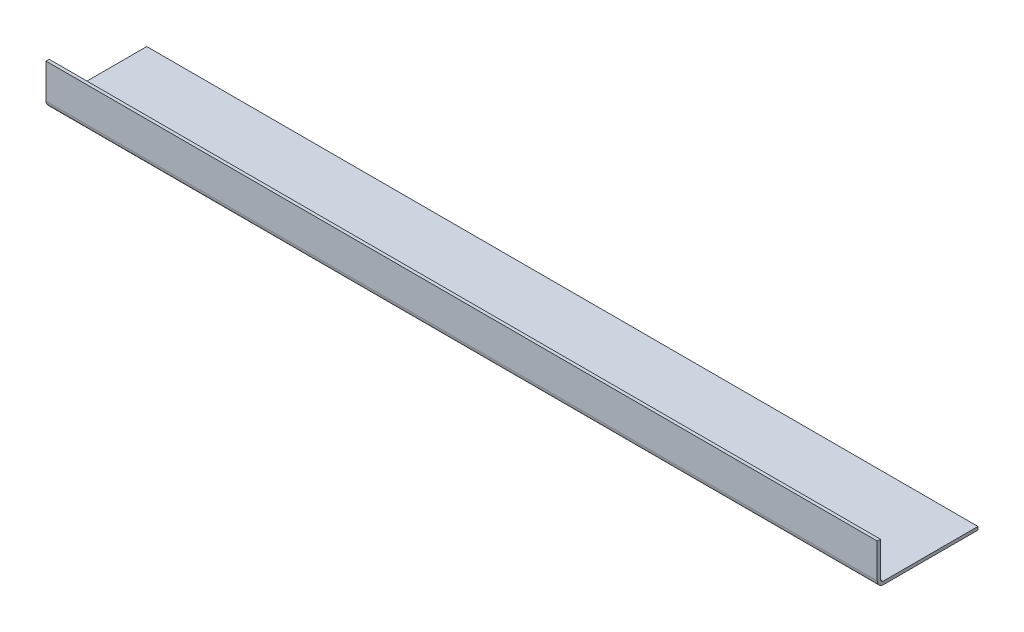
ISO-10303-21;
HEADER;
FILE_DESCRIPTION(('STEP AP214'),'2;1');
FILE_NAME('part.step','',(''),(''),'','','');
FILE_SCHEMA(('AUTOMOTIVE_DESIGN { 1 0 10303 214 1 1 1 1 }'));
ENDSEC;
DATA;
#1=APPLICATION_CONTEXT('core data for automotive mechanical design processes');
#2=APPLICATION_PROTOCOL_DEFINITION('international standard','automotive_design',2000,#1);
#3=PRODUCT_CONTEXT('',#1,'mechanical');
#4=PRODUCT('Part','Part','',(#3));
#5=PRODUCT_RELATED_PRODUCT_CATEGORY('part','',(#4));
#6=PRODUCT_DEFINITION_FORMATION('','',#4);
#7=PRODUCT_DEFINITION_CONTEXT('part definition',#1,'design');
#8=PRODUCT_DEFINITION('design','',#6,#7);
#9=PRODUCT_DEFINITION_SHAPE('','',#8);
#10=(LENGTH_UNIT() NAMED_UNIT(*) SI_UNIT(.MILLI.,.METRE.));
#11=(NAMED_UNIT(*) PLANE_ANGLE_UNIT() SI_UNIT($,.RADIAN.));
#12=(NAMED_UNIT(*) SI_UNIT($,.STERADIAN.) SOLID_ANGLE_UNIT());
#13=UNCERTAINTY_MEASURE_WITH_UNIT(LENGTH_MEASURE(1.E-05),#10,'distance_accuracy_value','');
#14=(GEOMETRIC_REPRESENTATION_CONTEXT(3) GLOBAL_UNCERTAINTY_ASSIGNED_CONTEXT((#13)) GLOBAL_UNIT_ASSIGNED_CONTEXT((#10,
#11,#12)) REPRESENTATION_CONTEXT('',''));
#15=CARTESIAN_POINT('',(0.,0.,0.));
#16=DIRECTION('',(0.,0.,1.));
#17=DIRECTION('',(1.,0.,0.));
#18=AXIS2_PLACEMENT_3D('',#15,#16,#17);
#19=CARTESIAN_POINT('',(0.,0.,-3.17499999999997));
#20=DIRECTION('',(0.,0.,-1.));
#21=DIRECTION('',(0.,1.,0.));
#22=AXIS2_PLACEMENT_3D('',#19,#20,#21);
#23=PLANE('',#22);
#24=DIRECTION('',(0.,1.,0.));
#25=VECTOR('',#24,1.);
#26=CARTESIAN_POINT('',(0.,0.,-3.17499999999997));
#27=LINE('',#26,#25);
#28=CARTESIAN_POINT('',(0.,3.17499999999997,-3.175));
#29=VERTEX_POINT('',#28);
#30=CARTESIAN_POINT('',(0.,38.1,-3.17499999999997));
#31=VERTEX_POINT('',#30);
#32=EDGE_CURVE('E89',#29,#31,#27,.T.);
#33=ORIENTED_EDGE('',*,*,#32,.T.);
#34=DIRECTION('',(1.,0.,0.));
#35=VECTOR('',#34,1.);
#36=CARTESIAN_POINT('',(0.,38.1,-3.17499999999997));
#37=LINE('',#36,#35);
#38=CARTESIAN_POINT('',(838.2,38.1,-3.17499999999997));
#39=VERTEX_POINT('',#38);
#40=EDGE_CURVE('E84',#31,#39,#37,.T.);
#41=ORIENTED_EDGE('',*,*,#40,.T.);
#42=DIRECTION('',(0.,-1.,0.));
#43=VECTOR('',#42,1.);
#44=CARTESIAN_POINT('',(838.2,38.1,-3.17499999999997));
#45=LINE('',#44,#43);
#46=CARTESIAN_POINT('',(838.2,3.17499999999997,-3.175));
#47=VERTEX_POINT('',#46);
#48=EDGE_CURVE('E79',#39,#47,#45,.T.);
#49=ORIENTED_EDGE('',*,*,#48,.T.);
#50=DIRECTION('',(1.,0.,0.));
#51=VECTOR('',#50,1.);
#52=CARTESIAN_POINT('',(838.2,3.17499999999997,-3.17500000000003));
#53=LINE('',#52,#51);
#54=EDGE_CURVE('E81',#47,#29,#53,.F.);
#55=ORIENTED_EDGE('',*,*,#54,.T.);
#56=EDGE_LOOP('',(#33,#41,#49,#55));
#57=FACE_BOUND('',#56,.T.);
#58=ADVANCED_FACE('F17',(#57),#23,.T.);
#59=CARTESIAN_POINT('',(0.,38.1,0.));
#60=DIRECTION('',(0.,-1.,0.));
#61=DIRECTION('',(0.,0.,-1.));
#62=AXIS2_PLACEMENT_3D('',#59,#60,#61);
#63=PLANE('',#62);
#64=DIRECTION('',(0.,0.,1.));
#65=VECTOR('',#64,1.);
#66=CARTESIAN_POINT('',(0.,38.1,0.));
#67=LINE('',#66,#65);
#68=CARTESIAN_POINT('',(0.,38.1,0.));
#69=VERTEX_POINT('',#68);
#70=EDGE_CURVE('E99',#31,#69,#67,.T.);
#71=ORIENTED_EDGE('',*,*,#70,.T.);
#72=DIRECTION('',(1.,0.,0.));
#73=VECTOR('',#72,1.);
#74=CARTESIAN_POINT('',(0.,38.1,0.));
#75=LINE('',#74,#73);
#76=CARTESIAN_POINT('',(838.2,38.1,0.));
#77=VERTEX_POINT('',#76);
#78=EDGE_CURVE('E107',#69,#77,#75,.T.);
#79=ORIENTED_EDGE('',*,*,#78,.T.);
#80=DIRECTION('',(0.,0.,1.));
#81=VECTOR('',#80,1.);
#82=CARTESIAN_POINT('',(838.2,38.1,0.));
#83=LINE('',#82,#81);
#84=EDGE_CURVE('E90',#77,#39,#83,.F.);
#85=ORIENTED_EDGE('',*,*,#84,.T.);
#86=ORIENTED_EDGE('',*,*,#40,.F.);
#87=EDGE_LOOP('',(#71,#79,#85,#86));
#88=FACE_BOUND('',#87,.T.);
#89=ADVANCED_FACE('F183',(#88),#63,.F.);
#90=CARTESIAN_POINT('',(838.2,3.17499999999997,-6.35000000000002));
#91=DIRECTION('',(1.,0.,0.));
#92=DIRECTION('',(0.,1.,0.));
#93=AXIS2_PLACEMENT_3D('',#90,#91,#92);
#94=CYLINDRICAL_SURFACE('',#93,3.175);
#95=CARTESIAN_POINT('',(0.,3.17499999999997,-6.35000000000002));
#96=DIRECTION('',(1.,0.,0.));
#97=DIRECTION('',(0.,1.,0.));
#98=AXIS2_PLACEMENT_3D('',#95,#96,#97);
#99=CIRCLE('',#98,3.175);
#100=CARTESIAN_POINT('',(0.,0.,-6.35000000000002));
#101=VERTEX_POINT('',#100);
#102=EDGE_CURVE('E98',#29,#101,#99,.T.);
#103=ORIENTED_EDGE('',*,*,#102,.F.);
#104=ORIENTED_EDGE('',*,*,#54,.F.);
#105=CARTESIAN_POINT('',(838.2,3.17499999999997,-6.35000000000002));
#106=DIRECTION('',(1.,0.,0.));
#107=DIRECTION('',(0.,1.,0.));
#108=AXIS2_PLACEMENT_3D('',#105,#106,#107);
#109=CIRCLE('',#108,3.175);
#110=CARTESIAN_POINT('',(838.2,0.,-6.35000000000002));
#111=VERTEX_POINT('',#110);
#112=EDGE_CURVE('E20',#47,#111,#109,.T.);
#113=ORIENTED_EDGE('',*,*,#112,.T.);
#114=DIRECTION('',(1.,0.,0.));
#115=VECTOR('',#114,1.);
#116=CARTESIAN_POINT('',(0.,0.,-6.35000000000002));
#117=LINE('',#116,#115);
#118=EDGE_CURVE('E129',#111,#101,#117,.F.);
#119=ORIENTED_EDGE('',*,*,#118,.T.);
#120=EDGE_LOOP('',(#103,#104,#113,#119));
#121=FACE_BOUND('',#120,.T.);
#122=ADVANCED_FACE('F95',(#121),#94,.F.);
#123=CARTESIAN_POINT('',(0.,0.,0.));
#124=DIRECTION('',(0.,0.,-1.));
#125=DIRECTION('',(0.,1.,0.));
#126=AXIS2_PLACEMENT_3D('',#123,#124,#125);
#127=PLANE('',#126);
#128=DIRECTION('',(0.,1.,0.));
#129=VECTOR('',#128,1.);
#130=CARTESIAN_POINT('',(838.2,0.,0.));
#131=LINE('',#130,#129);
#132=CARTESIAN_POINT('',(838.2,3.17499999999997,0.));
#133=VERTEX_POINT('',#132);
#134=EDGE_CURVE('E112',#77,#133,#131,.F.);
#135=ORIENTED_EDGE('',*,*,#134,.F.);
#136=ORIENTED_EDGE('',*,*,#78,.F.);
#137=DIRECTION('',(0.,1.,0.));
#138=VECTOR('',#137,1.);
#139=CARTESIAN_POINT('',(0.,0.,0.));
#140=LINE('',#139,#138);
#141=CARTESIAN_POINT('',(0.,3.17499999999997,0.));
#142=VERTEX_POINT('',#141);
#143=EDGE_CURVE('E105',#142,#69,#140,.T.);
#144=ORIENTED_EDGE('',*,*,#143,.F.);
#145=DIRECTION('',(1.,0.,0.));
#146=VECTOR('',#145,1.);
#147=CARTESIAN_POINT('',(838.2,3.17499999999997,0.));
#148=LINE('',#147,#146);
#149=EDGE_CURVE('E116',#133,#142,#148,.F.);
#150=ORIENTED_EDGE('',*,*,#149,.F.);
#151=EDGE_LOOP('',(#135,#136,#144,#150));
#152=FACE_BOUND('',#151,.T.);
#153=ADVANCED_FACE('F181',(#152),#127,.F.);
#154=CARTESIAN_POINT('',(0.,0.,0.));
#155=DIRECTION('',(0.,-1.,0.));
#156=DIRECTION('',(0.,0.,-1.));
#157=AXIS2_PLACEMENT_3D('',#154,#155,#156);
#158=PLANE('',#157);
#159=DIRECTION('',(0.,0.,1.));
#160=VECTOR('',#159,1.);
#161=CARTESIAN_POINT('',(838.2,0.,0.));
#162=LINE('',#161,#160);
#163=CARTESIAN_POINT('',(838.2,0.,-101.6));
#164=VERTEX_POINT('',#163);
#165=EDGE_CURVE('E104',#164,#111,#162,.T.);
#166=ORIENTED_EDGE('',*,*,#165,.F.);
#167=DIRECTION('',(1.,0.,0.));
#168=VECTOR('',#167,1.);
#169=CARTESIAN_POINT('',(0.,0.,-101.6));
#170=LINE('',#169,#168);
#171=CARTESIAN_POINT('',(0.,0.,-101.6));
#172=VERTEX_POINT('',#171);
#173=EDGE_CURVE('E135',#172,#164,#170,.T.);
#174=ORIENTED_EDGE('',*,*,#173,.F.);
#175=DIRECTION('',(0.,0.,1.));
#176=VECTOR('',#175,1.);
#177=CARTESIAN_POINT('',(0.,0.,0.));
#178=LINE('',#177,#176);
#179=EDGE_CURVE('E140',#101,#172,#178,.F.);
#180=ORIENTED_EDGE('',*,*,#179,.F.);
#181=ORIENTED_EDGE('',*,*,#118,.F.);
#182=EDGE_LOOP('',(#166,#174,#180,#181));
#183=FACE_BOUND('',#182,.T.);
#184=ADVANCED_FACE('F204',(#183),#158,.F.);
#185=CARTESIAN_POINT('',(838.2,-3.175,0.));
#186=DIRECTION('',(1.,0.,0.));
#187=DIRECTION('',(0.,1.,0.));
#188=AXIS2_PLACEMENT_3D('',#185,#186,#187);
#189=PLANE('',#188);
#190=DIRECTION('',(0.,0.,-1.));
#191=VECTOR('',#190,1.);
#192=CARTESIAN_POINT('',(838.2,-3.175,0.));
#193=LINE('',#192,#191);
#194=CARTESIAN_POINT('',(838.2,-3.175,-101.6));
#195=VERTEX_POINT('',#194);
#196=CARTESIAN_POINT('',(838.2,-3.17500000000001,-6.35000000000002));
#197=VERTEX_POINT('',#196);
#198=EDGE_CURVE('E123',#195,#197,#193,.F.);
#199=ORIENTED_EDGE('',*,*,#198,.F.);
#200=DIRECTION('',(0.,1.,0.));
#201=VECTOR('',#200,1.);
#202=CARTESIAN_POINT('',(838.2,-3.175,-101.6));
#203=LINE('',#202,#201);
#204=EDGE_CURVE('E132',#164,#195,#203,.F.);
#205=ORIENTED_EDGE('',*,*,#204,.F.);
#206=ORIENTED_EDGE('',*,*,#165,.T.);
#207=ORIENTED_EDGE('',*,*,#112,.F.);
#208=ORIENTED_EDGE('',*,*,#48,.F.);
#209=ORIENTED_EDGE('',*,*,#84,.F.);
#210=ORIENTED_EDGE('',*,*,#134,.T.);
#211=CARTESIAN_POINT('',(838.2,3.17499999999997,-6.35000000000002));
#212=DIRECTION('',(1.,0.,0.));
#213=DIRECTION('',(0.,1.,0.));
#214=AXIS2_PLACEMENT_3D('',#211,#212,#213);
#215=CIRCLE('',#214,6.35);
#216=EDGE_CURVE('E128',#197,#133,#215,.F.);
#217=ORIENTED_EDGE('',*,*,#216,.F.);
#218=EDGE_LOOP('',(#199,#205,#206,#207,#208,#209,#210,#217));
#219=FACE_BOUND('',#218,.T.);
#220=ADVANCED_FACE('F102',(#219),#189,.T.);
#221=CARTESIAN_POINT('',(838.2,3.17499999999997,-6.35000000000002));
#222=DIRECTION('',(1.,0.,0.));
#223=DIRECTION('',(0.,1.,0.));
#224=AXIS2_PLACEMENT_3D('',#221,#222,#223);
#225=CYLINDRICAL_SURFACE('',#224,6.35);
#226=ORIENTED_EDGE('',*,*,#149,.T.);
#227=CARTESIAN_POINT('',(0.,3.17499999999997,-6.35000000000002));
#228=DIRECTION('',(1.,0.,0.));
#229=DIRECTION('',(0.,1.,0.));
#230=AXIS2_PLACEMENT_3D('',#227,#228,#229);
#231=CIRCLE('',#230,6.35);
#232=CARTESIAN_POINT('',(0.,-3.17500000000001,-6.35000000000002));
#233=VERTEX_POINT('',#232);
#234=EDGE_CURVE('E159',#142,#233,#231,.T.);
#235=ORIENTED_EDGE('',*,*,#234,.T.);
#236=DIRECTION('',(1.,0.,0.));
#237=VECTOR('',#236,1.);
#238=CARTESIAN_POINT('',(0.,-3.175,-6.35000000000002));
#239=LINE('',#238,#237);
#240=EDGE_CURVE('E126',#197,#233,#239,.F.);
#241=ORIENTED_EDGE('',*,*,#240,.F.);
#242=ORIENTED_EDGE('',*,*,#216,.T.);
#243=EDGE_LOOP('',(#226,#235,#241,#242));
#244=FACE_BOUND('',#243,.T.);
#245=ADVANCED_FACE('F178',(#244),#225,.T.);
#246=CARTESIAN_POINT('',(0.,-3.175,0.));
#247=DIRECTION('',(-1.,0.,0.));
#248=DIRECTION('',(0.,-1.,0.));
#249=AXIS2_PLACEMENT_3D('',#246,#247,#248);
#250=PLANE('',#249);
#251=DIRECTION('',(0.,1.,0.));
#252=VECTOR('',#251,1.);
#253=CARTESIAN_POINT('',(0.,-3.175,-101.6));
#254=LINE('',#253,#252);
#255=CARTESIAN_POINT('',(0.,-3.175,-101.6));
#256=VERTEX_POINT('',#255);
#257=EDGE_CURVE('E35',#256,#172,#254,.T.);
#258=ORIENTED_EDGE('',*,*,#257,.F.);
#259=DIRECTION('',(0.,0.,-1.));
#260=VECTOR('',#259,1.);
#261=CARTESIAN_POINT('',(0.,-3.175,0.));
#262=LINE('',#261,#260);
#263=EDGE_CURVE('E26',#233,#256,#262,.T.);
#264=ORIENTED_EDGE('',*,*,#263,.F.);
#265=ORIENTED_EDGE('',*,*,#234,.F.);
#266=ORIENTED_EDGE('',*,*,#143,.T.);
#267=ORIENTED_EDGE('',*,*,#70,.F.);
#268=ORIENTED_EDGE('',*,*,#32,.F.);
#269=ORIENTED_EDGE('',*,*,#102,.T.);
#270=ORIENTED_EDGE('',*,*,#179,.T.);
#271=EDGE_LOOP('',(#258,#264,#265,#266,#267,#268,#269,#270));
#272=FACE_BOUND('',#271,.T.);
#273=ADVANCED_FACE('F174',(#272),#250,.T.);
#274=CARTESIAN_POINT('',(0.,-3.175,-101.6));
#275=DIRECTION('',(0.,0.,-1.));
#276=DIRECTION('',(0.,1.,0.));
#277=AXIS2_PLACEMENT_3D('',#274,#275,#276);
#278=PLANE('',#277);
#279=DIRECTION('',(1.,0.,0.));
#280=VECTOR('',#279,1.);
#281=CARTESIAN_POINT('',(0.,-3.175,-101.6));
#282=LINE('',#281,#280);
#283=EDGE_CURVE('E11',#256,#195,#282,.T.);
#284=ORIENTED_EDGE('',*,*,#283,.F.);
#285=ORIENTED_EDGE('',*,*,#257,.T.);
#286=ORIENTED_EDGE('',*,*,#173,.T.);
#287=ORIENTED_EDGE('',*,*,#204,.T.);
#288=EDGE_LOOP('',(#284,#285,#286,#287));
#289=FACE_BOUND('',#288,.T.);
#290=ADVANCED_FACE('F170',(#289),#278,.T.);
#291=CARTESIAN_POINT('',(0.,-3.175,0.));
#292=DIRECTION('',(0.,-1.,0.));
#293=DIRECTION('',(0.,0.,-1.));
#294=AXIS2_PLACEMENT_3D('',#291,#292,#293);
#295=PLANE('',#294);
#296=ORIENTED_EDGE('',*,*,#263,.T.);
#297=ORIENTED_EDGE('',*,*,#283,.T.);
#298=ORIENTED_EDGE('',*,*,#198,.T.);
#299=ORIENTED_EDGE('',*,*,#240,.T.);
#300=EDGE_LOOP('',(#296,#297,#298,#299));
#301=FACE_BOUND('',#300,.T.);
#302=ADVANCED_FACE('F172',(#301),#295,.T.);
#303=CLOSED_SHELL('',(#58,#89,#122,#153,#184,#220,#245,#273,#290,#302));
#304=MANIFOLD_SOLID_BREP('B1',#303);
#305=ADVANCED_BREP_SHAPE_REPRESENTATION('',(#18,#304),#14);
#306=SHAPE_DEFINITION_REPRESENTATION(#9,#305);
ENDSEC;
END-ISO-10303-21;
